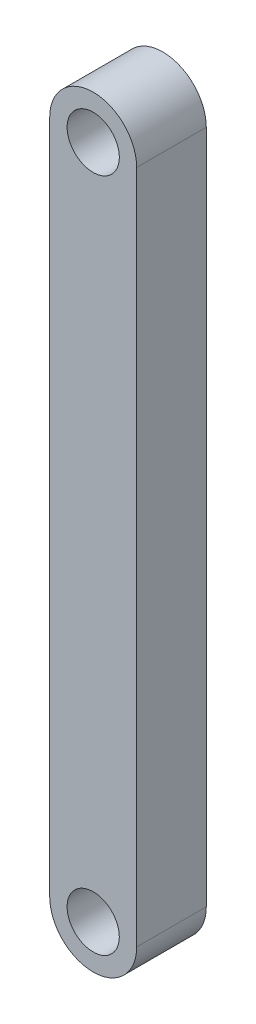
ISO-10303-21;
HEADER;
FILE_DESCRIPTION(('STEP AP214'),'2;1');
FILE_NAME('part.step','',(''),(''),'','','');
FILE_SCHEMA(('AUTOMOTIVE_DESIGN { 1 0 10303 214 1 1 1 1 }'));
ENDSEC;
DATA;
#1=APPLICATION_CONTEXT('core data for automotive mechanical design processes');
#2=APPLICATION_PROTOCOL_DEFINITION('international standard','automotive_design',2000,#1);
#3=PRODUCT_CONTEXT('',#1,'mechanical');
#4=PRODUCT('Part','Part','',(#3));
#5=PRODUCT_RELATED_PRODUCT_CATEGORY('part','',(#4));
#6=PRODUCT_DEFINITION_FORMATION('','',#4);
#7=PRODUCT_DEFINITION_CONTEXT('part definition',#1,'design');
#8=PRODUCT_DEFINITION('design','',#6,#7);
#9=PRODUCT_DEFINITION_SHAPE('','',#8);
#10=(LENGTH_UNIT() NAMED_UNIT(*) SI_UNIT(.MILLI.,.METRE.));
#11=(NAMED_UNIT(*) PLANE_ANGLE_UNIT() SI_UNIT($,.RADIAN.));
#12=(NAMED_UNIT(*) SI_UNIT($,.STERADIAN.) SOLID_ANGLE_UNIT());
#13=UNCERTAINTY_MEASURE_WITH_UNIT(LENGTH_MEASURE(1.E-05),#10,'distance_accuracy_value','');
#14=(GEOMETRIC_REPRESENTATION_CONTEXT(3) GLOBAL_UNCERTAINTY_ASSIGNED_CONTEXT((#13)) GLOBAL_UNIT_ASSIGNED_CONTEXT((#10,
#11,#12)) REPRESENTATION_CONTEXT('',''));
#15=CARTESIAN_POINT('',(0.,0.,0.));
#16=DIRECTION('',(0.,0.,1.));
#17=DIRECTION('',(1.,0.,0.));
#18=AXIS2_PLACEMENT_3D('',#15,#16,#17);
#19=CARTESIAN_POINT('',(0.,0.,4.));
#20=DIRECTION('',(0.,0.,1.));
#21=DIRECTION('',(1.,0.,0.));
#22=AXIS2_PLACEMENT_3D('',#19,#20,#21);
#23=PLANE('',#22);
#24=CARTESIAN_POINT('',(0.,0.,4.));
#25=DIRECTION('',(0.,0.,1.));
#26=DIRECTION('',(1.,0.,0.));
#27=AXIS2_PLACEMENT_3D('',#24,#25,#26);
#28=CIRCLE('',#27,1.5);
#29=CARTESIAN_POINT('',(1.5,0.,4.));
#30=VERTEX_POINT('',#29);
#31=EDGE_CURVE('E106',#30,#30,#28,.T.);
#32=ORIENTED_EDGE('',*,*,#31,.F.);
#33=EDGE_LOOP('',(#32));
#34=FACE_BOUND('',#33,.T.);
#35=CARTESIAN_POINT('',(0.,0.,4.));
#36=DIRECTION('',(0.,0.,1.));
#37=DIRECTION('',(1.,0.,0.));
#38=AXIS2_PLACEMENT_3D('',#35,#36,#37);
#39=CIRCLE('',#38,2.5);
#40=CARTESIAN_POINT('',(-2.5,0.,4.));
#41=VERTEX_POINT('',#40);
#42=CARTESIAN_POINT('',(2.5,0.,4.));
#43=VERTEX_POINT('',#42);
#44=EDGE_CURVE('E91',#41,#43,#39,.T.);
#45=ORIENTED_EDGE('',*,*,#44,.T.);
#46=DIRECTION('',(0.,1.,0.));
#47=VECTOR('',#46,1.);
#48=CARTESIAN_POINT('',(2.5,0.,4.));
#49=LINE('',#48,#47);
#50=CARTESIAN_POINT('',(2.5,38.8,4.));
#51=VERTEX_POINT('',#50);
#52=EDGE_CURVE('E86',#43,#51,#49,.T.);
#53=ORIENTED_EDGE('',*,*,#52,.T.);
#54=CARTESIAN_POINT('',(0.,38.8,4.));
#55=DIRECTION('',(0.,0.,1.));
#56=DIRECTION('',(1.,0.,0.));
#57=AXIS2_PLACEMENT_3D('',#54,#55,#56);
#58=CIRCLE('',#57,2.5);
#59=CARTESIAN_POINT('',(-2.5,38.8,4.));
#60=VERTEX_POINT('',#59);
#61=EDGE_CURVE('E89',#51,#60,#58,.T.);
#62=ORIENTED_EDGE('',*,*,#61,.T.);
#63=DIRECTION('',(0.,-1.,0.));
#64=VECTOR('',#63,1.);
#65=CARTESIAN_POINT('',(-2.5,0.,4.));
#66=LINE('',#65,#64);
#67=EDGE_CURVE('E56',#60,#41,#66,.T.);
#68=ORIENTED_EDGE('',*,*,#67,.T.);
#69=EDGE_LOOP('',(#45,#53,#62,#68));
#70=FACE_BOUND('',#69,.T.);
#71=CARTESIAN_POINT('',(0.,38.8,4.));
#72=DIRECTION('',(0.,0.,1.));
#73=DIRECTION('',(-1.,0.,0.));
#74=AXIS2_PLACEMENT_3D('',#71,#72,#73);
#75=CIRCLE('',#74,1.5);
#76=CARTESIAN_POINT('',(-1.5,38.8,4.));
#77=VERTEX_POINT('',#76);
#78=EDGE_CURVE('E121',#77,#77,#75,.T.);
#79=ORIENTED_EDGE('',*,*,#78,.F.);
#80=EDGE_LOOP('',(#79));
#81=FACE_BOUND('',#80,.T.);
#82=ADVANCED_FACE('F39',(#34,#70,#81),#23,.T.);
#83=CARTESIAN_POINT('',(0.,0.,0.));
#84=DIRECTION('',(0.,0.,1.));
#85=DIRECTION('',(1.,0.,0.));
#86=AXIS2_PLACEMENT_3D('',#83,#84,#85);
#87=PLANE('',#86);
#88=CARTESIAN_POINT('',(0.,0.,0.));
#89=DIRECTION('',(0.,0.,1.));
#90=DIRECTION('',(1.,0.,0.));
#91=AXIS2_PLACEMENT_3D('',#88,#89,#90);
#92=CIRCLE('',#91,2.5);
#93=CARTESIAN_POINT('',(-2.5,0.,0.));
#94=VERTEX_POINT('',#93);
#95=CARTESIAN_POINT('',(2.5,0.,0.));
#96=VERTEX_POINT('',#95);
#97=EDGE_CURVE('E103',#94,#96,#92,.T.);
#98=ORIENTED_EDGE('',*,*,#97,.F.);
#99=DIRECTION('',(0.,-1.,0.));
#100=VECTOR('',#99,1.);
#101=CARTESIAN_POINT('',(-2.5,0.,0.));
#102=LINE('',#101,#100);
#103=CARTESIAN_POINT('',(-2.5,38.8,0.));
#104=VERTEX_POINT('',#103);
#105=EDGE_CURVE('E79',#104,#94,#102,.T.);
#106=ORIENTED_EDGE('',*,*,#105,.F.);
#107=CARTESIAN_POINT('',(0.,38.8,0.));
#108=DIRECTION('',(0.,0.,1.));
#109=DIRECTION('',(1.,0.,0.));
#110=AXIS2_PLACEMENT_3D('',#107,#108,#109);
#111=CIRCLE('',#110,2.5);
#112=CARTESIAN_POINT('',(2.5,38.8,0.));
#113=VERTEX_POINT('',#112);
#114=EDGE_CURVE('E73',#113,#104,#111,.T.);
#115=ORIENTED_EDGE('',*,*,#114,.F.);
#116=DIRECTION('',(0.,1.,0.));
#117=VECTOR('',#116,1.);
#118=CARTESIAN_POINT('',(2.5,0.,0.));
#119=LINE('',#118,#117);
#120=EDGE_CURVE('E95',#96,#113,#119,.T.);
#121=ORIENTED_EDGE('',*,*,#120,.F.);
#122=EDGE_LOOP('',(#98,#106,#115,#121));
#123=FACE_BOUND('',#122,.T.);
#124=CARTESIAN_POINT('',(0.,0.,0.));
#125=DIRECTION('',(0.,0.,1.));
#126=DIRECTION('',(1.,0.,0.));
#127=AXIS2_PLACEMENT_3D('',#124,#125,#126);
#128=CIRCLE('',#127,1.5);
#129=CARTESIAN_POINT('',(1.5,0.,0.));
#130=VERTEX_POINT('',#129);
#131=EDGE_CURVE('E118',#130,#130,#128,.T.);
#132=ORIENTED_EDGE('',*,*,#131,.T.);
#133=EDGE_LOOP('',(#132));
#134=FACE_BOUND('',#133,.T.);
#135=CARTESIAN_POINT('',(0.,38.8,0.));
#136=DIRECTION('',(0.,0.,1.));
#137=DIRECTION('',(-1.,0.,0.));
#138=AXIS2_PLACEMENT_3D('',#135,#136,#137);
#139=CIRCLE('',#138,1.5);
#140=CARTESIAN_POINT('',(-1.5,38.8,0.));
#141=VERTEX_POINT('',#140);
#142=EDGE_CURVE('E124',#141,#141,#139,.T.);
#143=ORIENTED_EDGE('',*,*,#142,.T.);
#144=EDGE_LOOP('',(#143));
#145=FACE_BOUND('',#144,.T.);
#146=ADVANCED_FACE('F114',(#123,#134,#145),#87,.F.);
#147=CARTESIAN_POINT('',(0.,0.,4.));
#148=DIRECTION('',(0.,0.,-1.));
#149=DIRECTION('',(-1.,0.,0.));
#150=AXIS2_PLACEMENT_3D('',#147,#148,#149);
#151=CYLINDRICAL_SURFACE('',#150,2.5);
#152=ORIENTED_EDGE('',*,*,#97,.T.);
#153=DIRECTION('',(0.,0.,-1.));
#154=VECTOR('',#153,1.);
#155=CARTESIAN_POINT('',(2.5,0.,4.));
#156=LINE('',#155,#154);
#157=EDGE_CURVE('E11',#43,#96,#156,.T.);
#158=ORIENTED_EDGE('',*,*,#157,.F.);
#159=ORIENTED_EDGE('',*,*,#44,.F.);
#160=DIRECTION('',(0.,0.,-1.));
#161=VECTOR('',#160,1.);
#162=CARTESIAN_POINT('',(-2.5,0.,4.));
#163=LINE('',#162,#161);
#164=EDGE_CURVE('E99',#41,#94,#163,.T.);
#165=ORIENTED_EDGE('',*,*,#164,.T.);
#166=EDGE_LOOP('',(#152,#158,#159,#165));
#167=FACE_BOUND('',#166,.T.);
#168=ADVANCED_FACE('F41',(#167),#151,.T.);
#169=CARTESIAN_POINT('',(2.5,0.,4.));
#170=DIRECTION('',(-1.,0.,0.));
#171=DIRECTION('',(0.,0.,1.));
#172=AXIS2_PLACEMENT_3D('',#169,#170,#171);
#173=PLANE('',#172);
#174=ORIENTED_EDGE('',*,*,#120,.T.);
#175=DIRECTION('',(0.,0.,-1.));
#176=VECTOR('',#175,1.);
#177=CARTESIAN_POINT('',(2.5,38.8,4.));
#178=LINE('',#177,#176);
#179=EDGE_CURVE('E48',#51,#113,#178,.T.);
#180=ORIENTED_EDGE('',*,*,#179,.F.);
#181=ORIENTED_EDGE('',*,*,#52,.F.);
#182=ORIENTED_EDGE('',*,*,#157,.T.);
#183=EDGE_LOOP('',(#174,#180,#181,#182));
#184=FACE_BOUND('',#183,.T.);
#185=ADVANCED_FACE('F94',(#184),#173,.F.);
#186=CARTESIAN_POINT('',(0.,38.8,4.));
#187=DIRECTION('',(0.,0.,-1.));
#188=DIRECTION('',(-1.,0.,0.));
#189=AXIS2_PLACEMENT_3D('',#186,#187,#188);
#190=CYLINDRICAL_SURFACE('',#189,2.5);
#191=ORIENTED_EDGE('',*,*,#114,.T.);
#192=DIRECTION('',(0.,0.,-1.));
#193=VECTOR('',#192,1.);
#194=CARTESIAN_POINT('',(-2.5,38.8,4.));
#195=LINE('',#194,#193);
#196=EDGE_CURVE('E96',#60,#104,#195,.T.);
#197=ORIENTED_EDGE('',*,*,#196,.F.);
#198=ORIENTED_EDGE('',*,*,#61,.F.);
#199=ORIENTED_EDGE('',*,*,#179,.T.);
#200=EDGE_LOOP('',(#191,#197,#198,#199));
#201=FACE_BOUND('',#200,.T.);
#202=ADVANCED_FACE('F97',(#201),#190,.T.);
#203=CARTESIAN_POINT('',(-2.5,0.,4.));
#204=DIRECTION('',(1.,0.,0.));
#205=DIRECTION('',(0.,0.,-1.));
#206=AXIS2_PLACEMENT_3D('',#203,#204,#205);
#207=PLANE('',#206);
#208=ORIENTED_EDGE('',*,*,#105,.T.);
#209=ORIENTED_EDGE('',*,*,#164,.F.);
#210=ORIENTED_EDGE('',*,*,#67,.F.);
#211=ORIENTED_EDGE('',*,*,#196,.T.);
#212=EDGE_LOOP('',(#208,#209,#210,#211));
#213=FACE_BOUND('',#212,.T.);
#214=ADVANCED_FACE('F111',(#213),#207,.F.);
#215=CARTESIAN_POINT('',(0.,0.,4.));
#216=DIRECTION('',(0.,0.,-1.));
#217=DIRECTION('',(-1.,0.,0.));
#218=AXIS2_PLACEMENT_3D('',#215,#216,#217);
#219=CYLINDRICAL_SURFACE('',#218,1.5);
#220=ORIENTED_EDGE('',*,*,#31,.T.);
#221=EDGE_LOOP('',(#220));
#222=FACE_BOUND('',#221,.T.);
#223=ORIENTED_EDGE('',*,*,#131,.F.);
#224=EDGE_LOOP('',(#223));
#225=FACE_BOUND('',#224,.T.);
#226=ADVANCED_FACE('F141',(#222,#225),#219,.F.);
#227=CARTESIAN_POINT('',(0.,38.8,4.));
#228=DIRECTION('',(0.,0.,-1.));
#229=DIRECTION('',(-1.,0.,0.));
#230=AXIS2_PLACEMENT_3D('',#227,#228,#229);
#231=CYLINDRICAL_SURFACE('',#230,1.5);
#232=ORIENTED_EDGE('',*,*,#78,.T.);
#233=EDGE_LOOP('',(#232));
#234=FACE_BOUND('',#233,.T.);
#235=ORIENTED_EDGE('',*,*,#142,.F.);
#236=EDGE_LOOP('',(#235));
#237=FACE_BOUND('',#236,.T.);
#238=ADVANCED_FACE('F130',(#234,#237),#231,.F.);
#239=CLOSED_SHELL('',(#82,#146,#168,#185,#202,#214,#226,#238));
#240=MANIFOLD_SOLID_BREP('B2',#239);
#241=ADVANCED_BREP_SHAPE_REPRESENTATION('',(#18,#240),#14);
#242=SHAPE_DEFINITION_REPRESENTATION(#9,#241);
ENDSEC;
END-ISO-10303-21;
